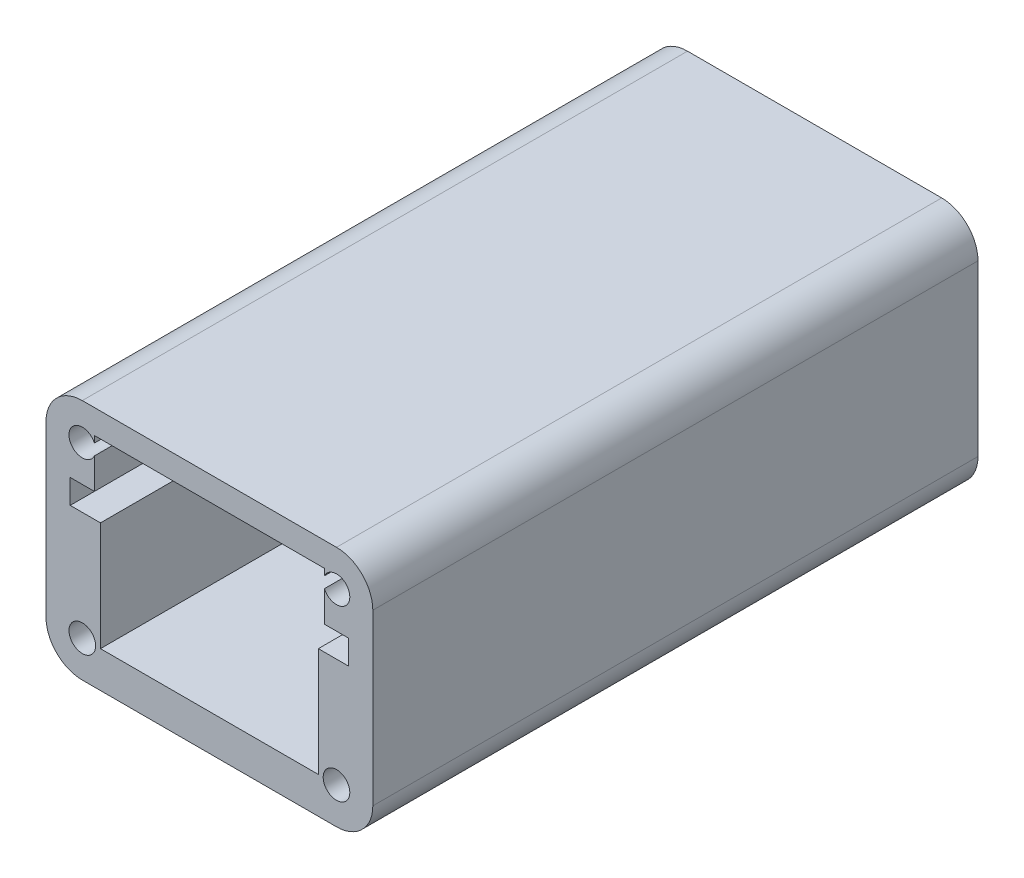
ISO-10303-21;
HEADER;
FILE_DESCRIPTION(('STEP AP214'),'2;1');
FILE_NAME('part.step','',(''),(''),'','','');
FILE_SCHEMA(('AUTOMOTIVE_DESIGN { 1 0 10303 214 1 1 1 1 }'));
ENDSEC;
DATA;
#1=APPLICATION_CONTEXT('core data for automotive mechanical design processes');
#2=APPLICATION_PROTOCOL_DEFINITION('international standard','automotive_design',2000,#1);
#3=PRODUCT_CONTEXT('',#1,'mechanical');
#4=PRODUCT('Part','Part','',(#3));
#5=PRODUCT_RELATED_PRODUCT_CATEGORY('part','',(#4));
#6=PRODUCT_DEFINITION_FORMATION('','',#4);
#7=PRODUCT_DEFINITION_CONTEXT('part definition',#1,'design');
#8=PRODUCT_DEFINITION('design','',#6,#7);
#9=PRODUCT_DEFINITION_SHAPE('','',#8);
#10=(LENGTH_UNIT() NAMED_UNIT(*) SI_UNIT(.MILLI.,.METRE.));
#11=(NAMED_UNIT(*) PLANE_ANGLE_UNIT() SI_UNIT($,.RADIAN.));
#12=(NAMED_UNIT(*) SI_UNIT($,.STERADIAN.) SOLID_ANGLE_UNIT());
#13=UNCERTAINTY_MEASURE_WITH_UNIT(LENGTH_MEASURE(1.E-05),#10,'distance_accuracy_value','');
#14=(GEOMETRIC_REPRESENTATION_CONTEXT(3) GLOBAL_UNCERTAINTY_ASSIGNED_CONTEXT((#13)) GLOBAL_UNIT_ASSIGNED_CONTEXT((#10,
#11,#12)) REPRESENTATION_CONTEXT('',''));
#15=CARTESIAN_POINT('',(0.,0.,0.));
#16=DIRECTION('',(0.,0.,1.));
#17=DIRECTION('',(1.,0.,0.));
#18=AXIS2_PLACEMENT_3D('',#15,#16,#17);
#19=CARTESIAN_POINT('',(23.,16.,-50.));
#20=DIRECTION('',(1.,0.,0.));
#21=DIRECTION('',(0.,0.,-1.));
#22=AXIS2_PLACEMENT_3D('',#19,#20,#21);
#23=PLANE('',#22);
#24=DIRECTION('',(0.,1.,0.));
#25=VECTOR('',#24,1.);
#26=CARTESIAN_POINT('',(23.,16.,0.));
#27=LINE('',#26,#25);
#28=CARTESIAN_POINT('',(23.,14.,0.));
#29=VERTEX_POINT('',#28);
#30=CARTESIAN_POINT('',(23.,16.5417424305044,0.));
#31=VERTEX_POINT('',#30);
#32=EDGE_CURVE('E385',#29,#31,#27,.T.);
#33=ORIENTED_EDGE('',*,*,#32,.T.);
#34=DIRECTION('',(0.,0.,1.));
#35=VECTOR('',#34,1.);
#36=CARTESIAN_POINT('',(23.,16.5417424305044,-6.));
#37=LINE('',#36,#35);
#38=CARTESIAN_POINT('',(23.,16.5417424305044,-6.));
#39=VERTEX_POINT('',#38);
#40=EDGE_CURVE('E61',#39,#31,#37,.T.);
#41=ORIENTED_EDGE('',*,*,#40,.F.);
#42=DIRECTION('',(0.,1.,0.));
#43=VECTOR('',#42,1.);
#44=CARTESIAN_POINT('',(23.,17.,-6.));
#45=LINE('',#44,#43);
#46=CARTESIAN_POINT('',(23.,17.4582575694956,-6.));
#47=VERTEX_POINT('',#46);
#48=EDGE_CURVE('E470',#39,#47,#45,.T.);
#49=ORIENTED_EDGE('',*,*,#48,.T.);
#50=DIRECTION('',(0.,0.,1.));
#51=VECTOR('',#50,1.);
#52=CARTESIAN_POINT('',(23.,17.4582575694956,-6.));
#53=LINE('',#52,#51);
#54=CARTESIAN_POINT('',(23.,17.4582575694956,0.));
#55=VERTEX_POINT('',#54);
#56=EDGE_CURVE('E242',#55,#47,#53,.F.);
#57=ORIENTED_EDGE('',*,*,#56,.F.);
#58=DIRECTION('',(0.,-1.,0.));
#59=VECTOR('',#58,1.);
#60=CARTESIAN_POINT('',(23.,0.,0.));
#61=LINE('',#60,#59);
#62=CARTESIAN_POINT('',(23.,18.,0.));
#63=VERTEX_POINT('',#62);
#64=EDGE_CURVE('E246',#63,#55,#61,.T.);
#65=ORIENTED_EDGE('',*,*,#64,.F.);
#66=DIRECTION('',(0.,0.,1.));
#67=VECTOR('',#66,1.);
#68=CARTESIAN_POINT('',(23.,18.,-67.0591185525459));
#69=LINE('',#68,#67);
#70=CARTESIAN_POINT('',(23.,18.,-48.));
#71=VERTEX_POINT('',#70);
#72=EDGE_CURVE('E235',#71,#63,#69,.T.);
#73=ORIENTED_EDGE('',*,*,#72,.F.);
#74=DIRECTION('',(0.,-1.,0.));
#75=VECTOR('',#74,1.);
#76=CARTESIAN_POINT('',(23.,17.,-48.));
#77=LINE('',#76,#75);
#78=CARTESIAN_POINT('',(23.,14.,-48.));
#79=VERTEX_POINT('',#78);
#80=EDGE_CURVE('E233',#71,#79,#77,.T.);
#81=ORIENTED_EDGE('',*,*,#80,.T.);
#82=DIRECTION('',(0.,0.,1.));
#83=VECTOR('',#82,1.);
#84=CARTESIAN_POINT('',(23.,14.,-50.));
#85=LINE('',#84,#83);
#86=EDGE_CURVE('E371',#79,#29,#85,.T.);
#87=ORIENTED_EDGE('',*,*,#86,.T.);
#88=EDGE_LOOP('',(#33,#41,#49,#57,#65,#73,#81,#87));
#89=FACE_BOUND('',#88,.T.);
#90=ADVANCED_FACE('F45',(#89),#23,.F.);
#91=CARTESIAN_POINT('',(4.,3.,-50.));
#92=DIRECTION('',(0.,-1.,0.));
#93=DIRECTION('',(1.,0.,0.));
#94=AXIS2_PLACEMENT_3D('',#91,#92,#93);
#95=PLANE('',#94);
#96=DIRECTION('',(1.,0.,0.));
#97=VECTOR('',#96,1.);
#98=CARTESIAN_POINT('',(4.,3.,0.));
#99=LINE('',#98,#97);
#100=CARTESIAN_POINT('',(4.5,3.,0.));
#101=VERTEX_POINT('',#100);
#102=CARTESIAN_POINT('',(22.5,3.,0.));
#103=VERTEX_POINT('',#102);
#104=EDGE_CURVE('E382',#101,#103,#99,.T.);
#105=ORIENTED_EDGE('',*,*,#104,.T.);
#106=DIRECTION('',(0.,0.,1.));
#107=VECTOR('',#106,1.);
#108=CARTESIAN_POINT('',(22.5,3.,-67.0065778087482));
#109=LINE('',#108,#107);
#110=CARTESIAN_POINT('',(22.5,3.,-48.));
#111=VERTEX_POINT('',#110);
#112=EDGE_CURVE('E290',#111,#103,#109,.T.);
#113=ORIENTED_EDGE('',*,*,#112,.F.);
#114=DIRECTION('',(-1.,0.,0.));
#115=VECTOR('',#114,1.);
#116=CARTESIAN_POINT('',(23.,3.,-48.));
#117=LINE('',#116,#115);
#118=CARTESIAN_POINT('',(4.5,3.,-48.));
#119=VERTEX_POINT('',#118);
#120=EDGE_CURVE('E221',#111,#119,#117,.T.);
#121=ORIENTED_EDGE('',*,*,#120,.T.);
#122=DIRECTION('',(0.,0.,1.));
#123=VECTOR('',#122,1.);
#124=CARTESIAN_POINT('',(4.5,3.,-67.0065778087482));
#125=LINE('',#124,#123);
#126=EDGE_CURVE('E313',#119,#101,#125,.T.);
#127=ORIENTED_EDGE('',*,*,#126,.T.);
#128=EDGE_LOOP('',(#105,#113,#121,#127));
#129=FACE_BOUND('',#128,.T.);
#130=ADVANCED_FACE('F494',(#129),#95,.F.);
#131=CARTESIAN_POINT('',(4.,4.,-50.));
#132=DIRECTION('',(-1.,0.,0.));
#133=DIRECTION('',(0.,0.,1.));
#134=AXIS2_PLACEMENT_3D('',#131,#132,#133);
#135=PLANE('',#134);
#136=DIRECTION('',(0.,1.,0.));
#137=VECTOR('',#136,1.);
#138=CARTESIAN_POINT('',(4.,17.,-48.));
#139=LINE('',#138,#137);
#140=CARTESIAN_POINT('',(4.,14.,-48.));
#141=VERTEX_POINT('',#140);
#142=CARTESIAN_POINT('',(4.,18.,-48.));
#143=VERTEX_POINT('',#142);
#144=EDGE_CURVE('E210',#141,#143,#139,.T.);
#145=ORIENTED_EDGE('',*,*,#144,.T.);
#146=DIRECTION('',(0.,0.,1.));
#147=VECTOR('',#146,1.);
#148=CARTESIAN_POINT('',(4.,18.,-67.0591185525459));
#149=LINE('',#148,#147);
#150=CARTESIAN_POINT('',(4.,18.,0.));
#151=VERTEX_POINT('',#150);
#152=EDGE_CURVE('E213',#143,#151,#149,.T.);
#153=ORIENTED_EDGE('',*,*,#152,.T.);
#154=DIRECTION('',(0.,1.,0.));
#155=VECTOR('',#154,1.);
#156=CARTESIAN_POINT('',(4.,0.,0.));
#157=LINE('',#156,#155);
#158=CARTESIAN_POINT('',(4.,17.4582575694956,0.));
#159=VERTEX_POINT('',#158);
#160=EDGE_CURVE('E258',#159,#151,#157,.T.);
#161=ORIENTED_EDGE('',*,*,#160,.F.);
#162=DIRECTION('',(0.,0.,1.));
#163=VECTOR('',#162,1.);
#164=CARTESIAN_POINT('',(4.,17.4582575694956,-6.));
#165=LINE('',#164,#163);
#166=CARTESIAN_POINT('',(4.,17.4582575694956,-6.));
#167=VERTEX_POINT('',#166);
#168=EDGE_CURVE('E250',#167,#159,#165,.T.);
#169=ORIENTED_EDGE('',*,*,#168,.F.);
#170=DIRECTION('',(0.,-1.,0.));
#171=VECTOR('',#170,1.);
#172=CARTESIAN_POINT('',(4.,17.,-6.));
#173=LINE('',#172,#171);
#174=CARTESIAN_POINT('',(4.,16.5417424305044,-6.));
#175=VERTEX_POINT('',#174);
#176=EDGE_CURVE('E54',#167,#175,#173,.T.);
#177=ORIENTED_EDGE('',*,*,#176,.T.);
#178=DIRECTION('',(0.,0.,1.));
#179=VECTOR('',#178,1.);
#180=CARTESIAN_POINT('',(4.,16.5417424305044,-6.));
#181=LINE('',#180,#179);
#182=CARTESIAN_POINT('',(4.,16.5417424305044,0.));
#183=VERTEX_POINT('',#182);
#184=EDGE_CURVE('E254',#183,#175,#181,.F.);
#185=ORIENTED_EDGE('',*,*,#184,.F.);
#186=DIRECTION('',(0.,-1.,0.));
#187=VECTOR('',#186,1.);
#188=CARTESIAN_POINT('',(4.,4.,0.));
#189=LINE('',#188,#187);
#190=CARTESIAN_POINT('',(4.,14.,0.));
#191=VERTEX_POINT('',#190);
#192=EDGE_CURVE('E220',#183,#191,#189,.T.);
#193=ORIENTED_EDGE('',*,*,#192,.T.);
#194=DIRECTION('',(0.,0.,-1.));
#195=VECTOR('',#194,1.);
#196=CARTESIAN_POINT('',(4.,14.,-50.));
#197=LINE('',#196,#195);
#198=EDGE_CURVE('E216',#191,#141,#197,.T.);
#199=ORIENTED_EDGE('',*,*,#198,.T.);
#200=EDGE_LOOP('',(#145,#153,#161,#169,#177,#185,#193,#199));
#201=FACE_BOUND('',#200,.T.);
#202=ADVANCED_FACE('F212',(#201),#135,.F.);
#203=CARTESIAN_POINT('',(0.,0.,-50.));
#204=DIRECTION('',(0.,-1.,0.));
#205=DIRECTION('',(0.,0.,-1.));
#206=AXIS2_PLACEMENT_3D('',#203,#204,#205);
#207=PLANE('',#206);
#208=DIRECTION('',(1.,0.,0.));
#209=VECTOR('',#208,1.);
#210=CARTESIAN_POINT('',(0.,0.,-50.));
#211=LINE('',#210,#209);
#212=CARTESIAN_POINT('',(3.,0.,-50.));
#213=VERTEX_POINT('',#212);
#214=CARTESIAN_POINT('',(24.,0.,-50.));
#215=VERTEX_POINT('',#214);
#216=EDGE_CURVE('E389',#213,#215,#211,.T.);
#217=ORIENTED_EDGE('',*,*,#216,.T.);
#218=DIRECTION('',(0.,0.,1.));
#219=VECTOR('',#218,1.);
#220=CARTESIAN_POINT('',(24.,0.,-50.));
#221=LINE('',#220,#219);
#222=CARTESIAN_POINT('',(24.,0.,0.));
#223=VERTEX_POINT('',#222);
#224=EDGE_CURVE('E422',#215,#223,#221,.T.);
#225=ORIENTED_EDGE('',*,*,#224,.T.);
#226=DIRECTION('',(1.,0.,0.));
#227=VECTOR('',#226,1.);
#228=CARTESIAN_POINT('',(0.,0.,0.));
#229=LINE('',#228,#227);
#230=CARTESIAN_POINT('',(3.,0.,0.));
#231=VERTEX_POINT('',#230);
#232=EDGE_CURVE('E388',#231,#223,#229,.T.);
#233=ORIENTED_EDGE('',*,*,#232,.F.);
#234=DIRECTION('',(0.,0.,1.));
#235=VECTOR('',#234,1.);
#236=CARTESIAN_POINT('',(3.,0.,-50.));
#237=LINE('',#236,#235);
#238=EDGE_CURVE('E405',#231,#213,#237,.F.);
#239=ORIENTED_EDGE('',*,*,#238,.T.);
#240=EDGE_LOOP('',(#217,#225,#233,#239));
#241=FACE_BOUND('',#240,.T.);
#242=ADVANCED_FACE('F507',(#241),#207,.T.);
#243=CARTESIAN_POINT('',(0.,20.,-50.));
#244=DIRECTION('',(-1.,0.,0.));
#245=DIRECTION('',(0.,0.,1.));
#246=AXIS2_PLACEMENT_3D('',#243,#244,#245);
#247=PLANE('',#246);
#248=DIRECTION('',(0.,-1.,0.));
#249=VECTOR('',#248,1.);
#250=CARTESIAN_POINT('',(0.,20.,-50.));
#251=LINE('',#250,#249);
#252=CARTESIAN_POINT('',(0.,17.,-50.));
#253=VERTEX_POINT('',#252);
#254=CARTESIAN_POINT('',(0.,3.,-50.));
#255=VERTEX_POINT('',#254);
#256=EDGE_CURVE('E401',#253,#255,#251,.T.);
#257=ORIENTED_EDGE('',*,*,#256,.T.);
#258=DIRECTION('',(0.,0.,1.));
#259=VECTOR('',#258,1.);
#260=CARTESIAN_POINT('',(0.,3.,-50.));
#261=LINE('',#260,#259);
#262=CARTESIAN_POINT('',(0.,3.,0.));
#263=VERTEX_POINT('',#262);
#264=EDGE_CURVE('E466',#255,#263,#261,.T.);
#265=ORIENTED_EDGE('',*,*,#264,.T.);
#266=DIRECTION('',(0.,-1.,0.));
#267=VECTOR('',#266,1.);
#268=CARTESIAN_POINT('',(0.,20.,0.));
#269=LINE('',#268,#267);
#270=CARTESIAN_POINT('',(0.,17.,0.));
#271=VERTEX_POINT('',#270);
#272=EDGE_CURVE('E394',#271,#263,#269,.T.);
#273=ORIENTED_EDGE('',*,*,#272,.F.);
#274=DIRECTION('',(0.,0.,1.));
#275=VECTOR('',#274,1.);
#276=CARTESIAN_POINT('',(0.,17.,-50.));
#277=LINE('',#276,#275);
#278=EDGE_CURVE('E463',#271,#253,#277,.F.);
#279=ORIENTED_EDGE('',*,*,#278,.T.);
#280=EDGE_LOOP('',(#257,#265,#273,#279));
#281=FACE_BOUND('',#280,.T.);
#282=ADVANCED_FACE('F516',(#281),#247,.T.);
#283=CARTESIAN_POINT('',(0.,20.,-50.));
#284=DIRECTION('',(0.,1.,0.));
#285=DIRECTION('',(0.,0.,1.));
#286=AXIS2_PLACEMENT_3D('',#283,#284,#285);
#287=PLANE('',#286);
#288=DIRECTION('',(-1.,0.,0.));
#289=VECTOR('',#288,1.);
#290=CARTESIAN_POINT('',(0.,20.,0.));
#291=LINE('',#290,#289);
#292=CARTESIAN_POINT('',(24.,20.,0.));
#293=VERTEX_POINT('',#292);
#294=CARTESIAN_POINT('',(3.,20.,0.));
#295=VERTEX_POINT('',#294);
#296=EDGE_CURVE('E413',#293,#295,#291,.T.);
#297=ORIENTED_EDGE('',*,*,#296,.F.);
#298=DIRECTION('',(0.,0.,1.));
#299=VECTOR('',#298,1.);
#300=CARTESIAN_POINT('',(24.,20.,-50.));
#301=LINE('',#300,#299);
#302=CARTESIAN_POINT('',(24.,20.,-50.));
#303=VERTEX_POINT('',#302);
#304=EDGE_CURVE('E460',#293,#303,#301,.F.);
#305=ORIENTED_EDGE('',*,*,#304,.T.);
#306=DIRECTION('',(-1.,0.,0.));
#307=VECTOR('',#306,1.);
#308=CARTESIAN_POINT('',(0.,20.,-50.));
#309=LINE('',#308,#307);
#310=CARTESIAN_POINT('',(3.,20.,-50.));
#311=VERTEX_POINT('',#310);
#312=EDGE_CURVE('E398',#303,#311,#309,.T.);
#313=ORIENTED_EDGE('',*,*,#312,.T.);
#314=DIRECTION('',(0.,0.,1.));
#315=VECTOR('',#314,1.);
#316=CARTESIAN_POINT('',(3.,20.,-50.));
#317=LINE('',#316,#315);
#318=EDGE_CURVE('E456',#311,#295,#317,.T.);
#319=ORIENTED_EDGE('',*,*,#318,.T.);
#320=EDGE_LOOP('',(#297,#305,#313,#319));
#321=FACE_BOUND('',#320,.T.);
#322=ADVANCED_FACE('F519',(#321),#287,.T.);
#323=CARTESIAN_POINT('',(27.,20.,-50.));
#324=DIRECTION('',(1.,0.,0.));
#325=DIRECTION('',(0.,1.,0.));
#326=AXIS2_PLACEMENT_3D('',#323,#324,#325);
#327=PLANE('',#326);
#328=DIRECTION('',(0.,1.,0.));
#329=VECTOR('',#328,1.);
#330=CARTESIAN_POINT('',(27.,20.,0.));
#331=LINE('',#330,#329);
#332=CARTESIAN_POINT('',(27.,3.,0.));
#333=VERTEX_POINT('',#332);
#334=CARTESIAN_POINT('',(27.,17.,0.));
#335=VERTEX_POINT('',#334);
#336=EDGE_CURVE('E409',#333,#335,#331,.T.);
#337=ORIENTED_EDGE('',*,*,#336,.F.);
#338=DIRECTION('',(0.,0.,1.));
#339=VECTOR('',#338,1.);
#340=CARTESIAN_POINT('',(27.,3.,-50.));
#341=LINE('',#340,#339);
#342=CARTESIAN_POINT('',(27.,3.,-50.));
#343=VERTEX_POINT('',#342);
#344=EDGE_CURVE('E442',#333,#343,#341,.F.);
#345=ORIENTED_EDGE('',*,*,#344,.T.);
#346=DIRECTION('',(0.,1.,0.));
#347=VECTOR('',#346,1.);
#348=CARTESIAN_POINT('',(27.,20.,-50.));
#349=LINE('',#348,#347);
#350=CARTESIAN_POINT('',(27.,17.,-50.));
#351=VERTEX_POINT('',#350);
#352=EDGE_CURVE('E393',#343,#351,#349,.T.);
#353=ORIENTED_EDGE('',*,*,#352,.T.);
#354=DIRECTION('',(0.,0.,1.));
#355=VECTOR('',#354,1.);
#356=CARTESIAN_POINT('',(27.,17.,-50.));
#357=LINE('',#356,#355);
#358=EDGE_CURVE('E438',#351,#335,#357,.T.);
#359=ORIENTED_EDGE('',*,*,#358,.T.);
#360=EDGE_LOOP('',(#337,#345,#353,#359));
#361=FACE_BOUND('',#360,.T.);
#362=ADVANCED_FACE('F512',(#361),#327,.T.);
#363=CARTESIAN_POINT('',(0.,0.,-50.));
#364=DIRECTION('',(0.,0.,-1.));
#365=DIRECTION('',(-1.,0.,0.));
#366=AXIS2_PLACEMENT_3D('',#363,#364,#365);
#367=PLANE('',#366);
#368=ORIENTED_EDGE('',*,*,#352,.F.);
#369=CARTESIAN_POINT('',(24.,3.,-50.));
#370=DIRECTION('',(0.,0.,-1.));
#371=DIRECTION('',(-1.,0.,0.));
#372=AXIS2_PLACEMENT_3D('',#369,#370,#371);
#373=CIRCLE('',#372,3.);
#374=EDGE_CURVE('E453',#343,#215,#373,.T.);
#375=ORIENTED_EDGE('',*,*,#374,.T.);
#376=ORIENTED_EDGE('',*,*,#216,.F.);
#377=CARTESIAN_POINT('',(3.,3.,-50.));
#378=DIRECTION('',(0.,0.,-1.));
#379=DIRECTION('',(-1.,0.,0.));
#380=AXIS2_PLACEMENT_3D('',#377,#378,#379);
#381=CIRCLE('',#380,3.);
#382=EDGE_CURVE('E447',#213,#255,#381,.T.);
#383=ORIENTED_EDGE('',*,*,#382,.T.);
#384=ORIENTED_EDGE('',*,*,#256,.F.);
#385=CARTESIAN_POINT('',(3.,17.,-50.));
#386=DIRECTION('',(0.,0.,-1.));
#387=DIRECTION('',(-1.,0.,0.));
#388=AXIS2_PLACEMENT_3D('',#385,#386,#387);
#389=CIRCLE('',#388,3.);
#390=EDGE_CURVE('E69',#253,#311,#389,.T.);
#391=ORIENTED_EDGE('',*,*,#390,.T.);
#392=ORIENTED_EDGE('',*,*,#312,.F.);
#393=CARTESIAN_POINT('',(24.,17.,-50.));
#394=DIRECTION('',(0.,0.,-1.));
#395=DIRECTION('',(-1.,0.,0.));
#396=AXIS2_PLACEMENT_3D('',#393,#394,#395);
#397=CIRCLE('',#396,3.);
#398=EDGE_CURVE('E450',#303,#351,#397,.T.);
#399=ORIENTED_EDGE('',*,*,#398,.T.);
#400=EDGE_LOOP('',(#368,#375,#376,#383,#384,#391,#392,#399));
#401=FACE_BOUND('',#400,.T.);
#402=ADVANCED_FACE('F508',(#401),#367,.T.);
#403=CARTESIAN_POINT('',(0.,0.,0.));
#404=DIRECTION('',(0.,0.,-1.));
#405=DIRECTION('',(-1.,0.,0.));
#406=AXIS2_PLACEMENT_3D('',#403,#404,#405);
#407=PLANE('',#406);
#408=CARTESIAN_POINT('',(3.,3.,0.));
#409=DIRECTION('',(0.,0.,1.));
#410=DIRECTION('',(1.,0.,0.));
#411=AXIS2_PLACEMENT_3D('',#408,#409,#410);
#412=CIRCLE('',#411,1.1);
#413=CARTESIAN_POINT('',(4.1,3.,0.));
#414=VERTEX_POINT('',#413);
#415=EDGE_CURVE('E279',#414,#414,#412,.T.);
#416=ORIENTED_EDGE('',*,*,#415,.F.);
#417=EDGE_LOOP('',(#416));
#418=FACE_BOUND('',#417,.T.);
#419=CARTESIAN_POINT('',(24.,3.,0.));
#420=DIRECTION('',(0.,0.,1.));
#421=DIRECTION('',(1.,0.,0.));
#422=AXIS2_PLACEMENT_3D('',#419,#420,#421);
#423=CIRCLE('',#422,1.1);
#424=CARTESIAN_POINT('',(25.1,3.,0.));
#425=VERTEX_POINT('',#424);
#426=EDGE_CURVE('E271',#425,#425,#423,.T.);
#427=ORIENTED_EDGE('',*,*,#426,.F.);
#428=EDGE_LOOP('',(#427));
#429=FACE_BOUND('',#428,.T.);
#430=CARTESIAN_POINT('',(24.,17.,0.));
#431=DIRECTION('',(0.,0.,1.));
#432=DIRECTION('',(1.,0.,0.));
#433=AXIS2_PLACEMENT_3D('',#430,#431,#432);
#434=CIRCLE('',#433,1.1);
#435=EDGE_CURVE('E262',#31,#55,#434,.T.);
#436=ORIENTED_EDGE('',*,*,#435,.F.);
#437=ORIENTED_EDGE('',*,*,#32,.F.);
#438=DIRECTION('',(-1.,0.,0.));
#439=VECTOR('',#438,1.);
#440=CARTESIAN_POINT('',(1.99999999999999,14.,0.));
#441=LINE('',#440,#439);
#442=CARTESIAN_POINT('',(25.,14.,0.));
#443=VERTEX_POINT('',#442);
#444=EDGE_CURVE('E325',#443,#29,#441,.T.);
#445=ORIENTED_EDGE('',*,*,#444,.F.);
#446=DIRECTION('',(0.,1.,0.));
#447=VECTOR('',#446,1.);
#448=CARTESIAN_POINT('',(25.,14.,0.));
#449=LINE('',#448,#447);
#450=CARTESIAN_POINT('',(25.,12.,0.));
#451=VERTEX_POINT('',#450);
#452=EDGE_CURVE('E330',#451,#443,#449,.T.);
#453=ORIENTED_EDGE('',*,*,#452,.F.);
#454=DIRECTION('',(1.,0.,0.));
#455=VECTOR('',#454,1.);
#456=CARTESIAN_POINT('',(1.99999999999999,12.,0.));
#457=LINE('',#456,#455);
#458=CARTESIAN_POINT('',(22.5,12.,0.));
#459=VERTEX_POINT('',#458);
#460=EDGE_CURVE('E336',#459,#451,#457,.T.);
#461=ORIENTED_EDGE('',*,*,#460,.F.);
#462=DIRECTION('',(0.,-1.,0.));
#463=VECTOR('',#462,1.);
#464=CARTESIAN_POINT('',(22.5,12.,0.));
#465=LINE('',#464,#463);
#466=EDGE_CURVE('E298',#459,#103,#465,.T.);
#467=ORIENTED_EDGE('',*,*,#466,.T.);
#468=ORIENTED_EDGE('',*,*,#104,.F.);
#469=DIRECTION('',(0.,1.,0.));
#470=VECTOR('',#469,1.);
#471=CARTESIAN_POINT('',(4.5,12.,0.));
#472=LINE('',#471,#470);
#473=CARTESIAN_POINT('',(4.5,12.,0.));
#474=VERTEX_POINT('',#473);
#475=EDGE_CURVE('E309',#101,#474,#472,.T.);
#476=ORIENTED_EDGE('',*,*,#475,.T.);
#477=CARTESIAN_POINT('',(1.99999999999999,12.,0.));
#478=VERTEX_POINT('',#477);
#479=EDGE_CURVE('E333',#478,#474,#457,.T.);
#480=ORIENTED_EDGE('',*,*,#479,.F.);
#481=DIRECTION('',(0.,-1.,0.));
#482=VECTOR('',#481,1.);
#483=CARTESIAN_POINT('',(1.99999999999999,14.,0.));
#484=LINE('',#483,#482);
#485=CARTESIAN_POINT('',(1.99999999999999,14.,0.));
#486=VERTEX_POINT('',#485);
#487=EDGE_CURVE('E322',#486,#478,#484,.T.);
#488=ORIENTED_EDGE('',*,*,#487,.F.);
#489=EDGE_CURVE('E329',#191,#486,#441,.T.);
#490=ORIENTED_EDGE('',*,*,#489,.F.);
#491=ORIENTED_EDGE('',*,*,#192,.F.);
#492=CARTESIAN_POINT('',(3.,17.,0.));
#493=DIRECTION('',(0.,0.,1.));
#494=DIRECTION('',(1.,0.,0.));
#495=AXIS2_PLACEMENT_3D('',#492,#493,#494);
#496=CIRCLE('',#495,1.1);
#497=EDGE_CURVE('E266',#159,#183,#496,.T.);
#498=ORIENTED_EDGE('',*,*,#497,.F.);
#499=ORIENTED_EDGE('',*,*,#160,.T.);
#500=DIRECTION('',(1.,0.,0.));
#501=VECTOR('',#500,1.);
#502=CARTESIAN_POINT('',(0.,18.,0.));
#503=LINE('',#502,#501);
#504=EDGE_CURVE('E11',#151,#63,#503,.T.);
#505=ORIENTED_EDGE('',*,*,#504,.T.);
#506=ORIENTED_EDGE('',*,*,#64,.T.);
#507=EDGE_LOOP('',(#436,#437,#445,#453,#461,#467,#468,#476,#480,#488,#490,#491,#498,#499,#505,#506));
#508=FACE_BOUND('',#507,.T.);
#509=ORIENTED_EDGE('',*,*,#232,.T.);
#510=CARTESIAN_POINT('',(24.,3.,0.));
#511=DIRECTION('',(0.,0.,-1.));
#512=DIRECTION('',(-1.,0.,0.));
#513=AXIS2_PLACEMENT_3D('',#510,#511,#512);
#514=CIRCLE('',#513,3.);
#515=EDGE_CURVE('E435',#223,#333,#514,.F.);
#516=ORIENTED_EDGE('',*,*,#515,.T.);
#517=ORIENTED_EDGE('',*,*,#336,.T.);
#518=CARTESIAN_POINT('',(24.,17.,0.));
#519=DIRECTION('',(0.,0.,-1.));
#520=DIRECTION('',(-1.,0.,0.));
#521=AXIS2_PLACEMENT_3D('',#518,#519,#520);
#522=CIRCLE('',#521,3.);
#523=EDGE_CURVE('E432',#335,#293,#522,.F.);
#524=ORIENTED_EDGE('',*,*,#523,.T.);
#525=ORIENTED_EDGE('',*,*,#296,.T.);
#526=CARTESIAN_POINT('',(3.,17.,0.));
#527=DIRECTION('',(0.,0.,-1.));
#528=DIRECTION('',(-1.,0.,0.));
#529=AXIS2_PLACEMENT_3D('',#526,#527,#528);
#530=CIRCLE('',#529,3.);
#531=EDGE_CURVE('E426',#295,#271,#530,.F.);
#532=ORIENTED_EDGE('',*,*,#531,.T.);
#533=ORIENTED_EDGE('',*,*,#272,.T.);
#534=CARTESIAN_POINT('',(3.,3.,0.));
#535=DIRECTION('',(0.,0.,-1.));
#536=DIRECTION('',(-1.,0.,0.));
#537=AXIS2_PLACEMENT_3D('',#534,#535,#536);
#538=CIRCLE('',#537,3.);
#539=EDGE_CURVE('E429',#263,#231,#538,.F.);
#540=ORIENTED_EDGE('',*,*,#539,.T.);
#541=EDGE_LOOP('',(#509,#516,#517,#524,#525,#532,#533,#540));
#542=FACE_BOUND('',#541,.T.);
#543=ADVANCED_FACE('F511',(#418,#429,#508,#542),#407,.F.);
#544=CARTESIAN_POINT('',(0.,0.,-48.));
#545=DIRECTION('',(0.,0.,-1.));
#546=DIRECTION('',(-1.,0.,0.));
#547=AXIS2_PLACEMENT_3D('',#544,#545,#546);
#548=PLANE('',#547);
#549=ORIENTED_EDGE('',*,*,#80,.F.);
#550=DIRECTION('',(-1.,0.,0.));
#551=VECTOR('',#550,1.);
#552=CARTESIAN_POINT('',(4.,18.,-48.));
#553=LINE('',#552,#551);
#554=EDGE_CURVE('E227',#71,#143,#553,.T.);
#555=ORIENTED_EDGE('',*,*,#554,.T.);
#556=ORIENTED_EDGE('',*,*,#144,.F.);
#557=DIRECTION('',(-1.,0.,0.));
#558=VECTOR('',#557,1.);
#559=CARTESIAN_POINT('',(1.99999999999999,14.,-48.));
#560=LINE('',#559,#558);
#561=CARTESIAN_POINT('',(1.99999999999999,14.,-48.));
#562=VERTEX_POINT('',#561);
#563=EDGE_CURVE('E353',#141,#562,#560,.T.);
#564=ORIENTED_EDGE('',*,*,#563,.T.);
#565=DIRECTION('',(0.,-1.,0.));
#566=VECTOR('',#565,1.);
#567=CARTESIAN_POINT('',(1.99999999999999,14.,-48.));
#568=LINE('',#567,#566);
#569=CARTESIAN_POINT('',(1.99999999999999,12.,-48.));
#570=VERTEX_POINT('',#569);
#571=EDGE_CURVE('E344',#562,#570,#568,.T.);
#572=ORIENTED_EDGE('',*,*,#571,.T.);
#573=DIRECTION('',(1.,0.,0.));
#574=VECTOR('',#573,1.);
#575=CARTESIAN_POINT('',(1.99999999999999,12.,-48.));
#576=LINE('',#575,#574);
#577=CARTESIAN_POINT('',(4.5,12.,-48.));
#578=VERTEX_POINT('',#577);
#579=EDGE_CURVE('E340',#570,#578,#576,.T.);
#580=ORIENTED_EDGE('',*,*,#579,.T.);
#581=DIRECTION('',(0.,1.,0.));
#582=VECTOR('',#581,1.);
#583=CARTESIAN_POINT('',(4.5,12.,-48.));
#584=LINE('',#583,#582);
#585=EDGE_CURVE('E314',#119,#578,#584,.T.);
#586=ORIENTED_EDGE('',*,*,#585,.F.);
#587=ORIENTED_EDGE('',*,*,#120,.F.);
#588=DIRECTION('',(0.,-1.,0.));
#589=VECTOR('',#588,1.);
#590=CARTESIAN_POINT('',(22.5,12.,-48.));
#591=LINE('',#590,#589);
#592=CARTESIAN_POINT('',(22.5,12.,-48.));
#593=VERTEX_POINT('',#592);
#594=EDGE_CURVE('E299',#593,#111,#591,.T.);
#595=ORIENTED_EDGE('',*,*,#594,.F.);
#596=CARTESIAN_POINT('',(25.,12.,-48.));
#597=VERTEX_POINT('',#596);
#598=EDGE_CURVE('E328',#593,#597,#576,.T.);
#599=ORIENTED_EDGE('',*,*,#598,.T.);
#600=DIRECTION('',(0.,1.,0.));
#601=VECTOR('',#600,1.);
#602=CARTESIAN_POINT('',(25.,14.,-48.));
#603=LINE('',#602,#601);
#604=CARTESIAN_POINT('',(25.,14.,-48.));
#605=VERTEX_POINT('',#604);
#606=EDGE_CURVE('E354',#597,#605,#603,.T.);
#607=ORIENTED_EDGE('',*,*,#606,.T.);
#608=EDGE_CURVE('E350',#605,#79,#560,.T.);
#609=ORIENTED_EDGE('',*,*,#608,.T.);
#610=EDGE_LOOP('',(#549,#555,#556,#564,#572,#580,#586,#587,#595,#599,#607,#609));
#611=FACE_BOUND('',#610,.T.);
#612=ADVANCED_FACE('F231',(#611),#548,.F.);
#613=CARTESIAN_POINT('',(1.99999999999999,14.,-71.0867927612304));
#614=DIRECTION('',(-1.,0.,0.));
#615=DIRECTION('',(0.,-1.,0.));
#616=AXIS2_PLACEMENT_3D('',#613,#614,#615);
#617=PLANE('',#616);
#618=DIRECTION('',(0.,0.,1.));
#619=VECTOR('',#618,1.);
#620=CARTESIAN_POINT('',(1.99999999999999,14.,-71.0867927612304));
#621=LINE('',#620,#619);
#622=EDGE_CURVE('E349',#562,#486,#621,.T.);
#623=ORIENTED_EDGE('',*,*,#622,.T.);
#624=ORIENTED_EDGE('',*,*,#487,.T.);
#625=DIRECTION('',(0.,0.,1.));
#626=VECTOR('',#625,1.);
#627=CARTESIAN_POINT('',(1.99999999999999,12.,-71.0867927612304));
#628=LINE('',#627,#626);
#629=EDGE_CURVE('E348',#570,#478,#628,.T.);
#630=ORIENTED_EDGE('',*,*,#629,.F.);
#631=ORIENTED_EDGE('',*,*,#571,.F.);
#632=EDGE_LOOP('',(#623,#624,#630,#631));
#633=FACE_BOUND('',#632,.T.);
#634=ADVANCED_FACE('F627',(#633),#617,.F.);
#635=CARTESIAN_POINT('',(1.99999999999999,14.,-71.0867927612304));
#636=DIRECTION('',(0.,1.,0.));
#637=DIRECTION('',(-1.,0.,0.));
#638=AXIS2_PLACEMENT_3D('',#635,#636,#637);
#639=PLANE('',#638);
#640=ORIENTED_EDGE('',*,*,#489,.T.);
#641=ORIENTED_EDGE('',*,*,#622,.F.);
#642=ORIENTED_EDGE('',*,*,#563,.F.);
#643=ORIENTED_EDGE('',*,*,#198,.F.);
#644=EDGE_LOOP('',(#640,#641,#642,#643));
#645=FACE_BOUND('',#644,.T.);
#646=ADVANCED_FACE('F713',(#645),#639,.F.);
#647=CARTESIAN_POINT('',(1.99999999999999,12.,-71.0867927612304));
#648=DIRECTION('',(0.,-1.,0.));
#649=DIRECTION('',(1.,0.,0.));
#650=AXIS2_PLACEMENT_3D('',#647,#648,#649);
#651=PLANE('',#650);
#652=ORIENTED_EDGE('',*,*,#579,.F.);
#653=ORIENTED_EDGE('',*,*,#629,.T.);
#654=ORIENTED_EDGE('',*,*,#479,.T.);
#655=DIRECTION('',(0.,0.,1.));
#656=VECTOR('',#655,1.);
#657=CARTESIAN_POINT('',(4.5,12.,-67.0065778087482));
#658=LINE('',#657,#656);
#659=EDGE_CURVE('E318',#578,#474,#658,.T.);
#660=ORIENTED_EDGE('',*,*,#659,.F.);
#661=EDGE_LOOP('',(#652,#653,#654,#660));
#662=FACE_BOUND('',#661,.T.);
#663=ADVANCED_FACE('F720',(#662),#651,.F.);
#664=ORIENTED_EDGE('',*,*,#460,.T.);
#665=DIRECTION('',(0.,0.,1.));
#666=VECTOR('',#665,1.);
#667=CARTESIAN_POINT('',(25.,12.,-71.0867927612304));
#668=LINE('',#667,#666);
#669=EDGE_CURVE('E343',#597,#451,#668,.T.);
#670=ORIENTED_EDGE('',*,*,#669,.F.);
#671=ORIENTED_EDGE('',*,*,#598,.F.);
#672=DIRECTION('',(0.,0.,1.));
#673=VECTOR('',#672,1.);
#674=CARTESIAN_POINT('',(22.5,12.,-67.0065778087482));
#675=LINE('',#674,#673);
#676=EDGE_CURVE('E294',#593,#459,#675,.T.);
#677=ORIENTED_EDGE('',*,*,#676,.T.);
#678=EDGE_LOOP('',(#664,#670,#671,#677));
#679=FACE_BOUND('',#678,.T.);
#680=ADVANCED_FACE('F710',(#679),#651,.F.);
#681=ORIENTED_EDGE('',*,*,#608,.F.);
#682=DIRECTION('',(0.,0.,1.));
#683=VECTOR('',#682,1.);
#684=CARTESIAN_POINT('',(25.,14.,-71.0867927612304));
#685=LINE('',#684,#683);
#686=EDGE_CURVE('E358',#605,#443,#685,.T.);
#687=ORIENTED_EDGE('',*,*,#686,.T.);
#688=ORIENTED_EDGE('',*,*,#444,.T.);
#689=ORIENTED_EDGE('',*,*,#86,.F.);
#690=EDGE_LOOP('',(#681,#687,#688,#689));
#691=FACE_BOUND('',#690,.T.);
#692=ADVANCED_FACE('F700',(#691),#639,.F.);
#693=CARTESIAN_POINT('',(25.,14.,-71.0867927612304));
#694=DIRECTION('',(1.,0.,0.));
#695=DIRECTION('',(0.,0.,-1.));
#696=AXIS2_PLACEMENT_3D('',#693,#694,#695);
#697=PLANE('',#696);
#698=ORIENTED_EDGE('',*,*,#669,.T.);
#699=ORIENTED_EDGE('',*,*,#452,.T.);
#700=ORIENTED_EDGE('',*,*,#686,.F.);
#701=ORIENTED_EDGE('',*,*,#606,.F.);
#702=EDGE_LOOP('',(#698,#699,#700,#701));
#703=FACE_BOUND('',#702,.T.);
#704=ADVANCED_FACE('F690',(#703),#697,.F.);
#705=CARTESIAN_POINT('',(22.5,12.,-67.0065778087482));
#706=DIRECTION('',(-1.,0.,0.));
#707=DIRECTION('',(0.,0.,1.));
#708=AXIS2_PLACEMENT_3D('',#705,#706,#707);
#709=PLANE('',#708);
#710=ORIENTED_EDGE('',*,*,#676,.F.);
#711=ORIENTED_EDGE('',*,*,#594,.T.);
#712=ORIENTED_EDGE('',*,*,#112,.T.);
#713=ORIENTED_EDGE('',*,*,#466,.F.);
#714=EDGE_LOOP('',(#710,#711,#712,#713));
#715=FACE_BOUND('',#714,.T.);
#716=ADVANCED_FACE('F681',(#715),#709,.T.);
#717=CARTESIAN_POINT('',(4.5,12.,-67.0065778087482));
#718=DIRECTION('',(1.,0.,0.));
#719=DIRECTION('',(0.,1.,0.));
#720=AXIS2_PLACEMENT_3D('',#717,#718,#719);
#721=PLANE('',#720);
#722=ORIENTED_EDGE('',*,*,#126,.F.);
#723=ORIENTED_EDGE('',*,*,#585,.T.);
#724=ORIENTED_EDGE('',*,*,#659,.T.);
#725=ORIENTED_EDGE('',*,*,#475,.F.);
#726=EDGE_LOOP('',(#722,#723,#724,#725));
#727=FACE_BOUND('',#726,.T.);
#728=ADVANCED_FACE('F534',(#727),#721,.T.);
#729=CARTESIAN_POINT('',(24.,3.,-50.));
#730=DIRECTION('',(0.,0.,1.));
#731=DIRECTION('',(1.,0.,0.));
#732=AXIS2_PLACEMENT_3D('',#729,#730,#731);
#733=CYLINDRICAL_SURFACE('',#732,3.);
#734=ORIENTED_EDGE('',*,*,#374,.F.);
#735=ORIENTED_EDGE('',*,*,#344,.F.);
#736=ORIENTED_EDGE('',*,*,#515,.F.);
#737=ORIENTED_EDGE('',*,*,#224,.F.);
#738=EDGE_LOOP('',(#734,#735,#736,#737));
#739=FACE_BOUND('',#738,.T.);
#740=ADVANCED_FACE('F530',(#739),#733,.T.);
#741=CARTESIAN_POINT('',(24.,17.,-50.));
#742=DIRECTION('',(0.,0.,1.));
#743=DIRECTION('',(1.,0.,0.));
#744=AXIS2_PLACEMENT_3D('',#741,#742,#743);
#745=CYLINDRICAL_SURFACE('',#744,3.);
#746=ORIENTED_EDGE('',*,*,#398,.F.);
#747=ORIENTED_EDGE('',*,*,#304,.F.);
#748=ORIENTED_EDGE('',*,*,#523,.F.);
#749=ORIENTED_EDGE('',*,*,#358,.F.);
#750=EDGE_LOOP('',(#746,#747,#748,#749));
#751=FACE_BOUND('',#750,.T.);
#752=ADVANCED_FACE('F533',(#751),#745,.T.);
#753=CARTESIAN_POINT('',(3.,3.,-50.));
#754=DIRECTION('',(0.,0.,1.));
#755=DIRECTION('',(1.,0.,0.));
#756=AXIS2_PLACEMENT_3D('',#753,#754,#755);
#757=CYLINDRICAL_SURFACE('',#756,3.);
#758=ORIENTED_EDGE('',*,*,#382,.F.);
#759=ORIENTED_EDGE('',*,*,#238,.F.);
#760=ORIENTED_EDGE('',*,*,#539,.F.);
#761=ORIENTED_EDGE('',*,*,#264,.F.);
#762=EDGE_LOOP('',(#758,#759,#760,#761));
#763=FACE_BOUND('',#762,.T.);
#764=ADVANCED_FACE('F537',(#763),#757,.T.);
#765=CARTESIAN_POINT('',(3.,17.,-50.));
#766=DIRECTION('',(0.,0.,1.));
#767=DIRECTION('',(1.,0.,0.));
#768=AXIS2_PLACEMENT_3D('',#765,#766,#767);
#769=CYLINDRICAL_SURFACE('',#768,3.);
#770=ORIENTED_EDGE('',*,*,#390,.F.);
#771=ORIENTED_EDGE('',*,*,#278,.F.);
#772=ORIENTED_EDGE('',*,*,#531,.F.);
#773=ORIENTED_EDGE('',*,*,#318,.F.);
#774=EDGE_LOOP('',(#770,#771,#772,#773));
#775=FACE_BOUND('',#774,.T.);
#776=ADVANCED_FACE('F47',(#775),#769,.T.);
#777=CARTESIAN_POINT('',(3.,17.,-6.));
#778=DIRECTION('',(0.,0.,1.));
#779=DIRECTION('',(1.,0.,0.));
#780=AXIS2_PLACEMENT_3D('',#777,#778,#779);
#781=CYLINDRICAL_SURFACE('',#780,1.1);
#782=ORIENTED_EDGE('',*,*,#497,.T.);
#783=ORIENTED_EDGE('',*,*,#184,.T.);
#784=CARTESIAN_POINT('',(3.,17.,-6.));
#785=DIRECTION('',(0.,0.,1.));
#786=DIRECTION('',(1.,0.,0.));
#787=AXIS2_PLACEMENT_3D('',#784,#785,#786);
#788=CIRCLE('',#787,1.1);
#789=EDGE_CURVE('E286',#167,#175,#788,.T.);
#790=ORIENTED_EDGE('',*,*,#789,.F.);
#791=ORIENTED_EDGE('',*,*,#168,.T.);
#792=EDGE_LOOP('',(#782,#783,#790,#791));
#793=FACE_BOUND('',#792,.T.);
#794=ADVANCED_FACE('F478',(#793),#781,.F.);
#795=CARTESIAN_POINT('',(3.,17.,-6.));
#796=DIRECTION('',(0.,0.,1.));
#797=DIRECTION('',(1.,0.,0.));
#798=AXIS2_PLACEMENT_3D('',#795,#796,#797);
#799=PLANE('',#798);
#800=ORIENTED_EDGE('',*,*,#176,.F.);
#801=ORIENTED_EDGE('',*,*,#789,.T.);
#802=EDGE_LOOP('',(#800,#801));
#803=FACE_BOUND('',#802,.T.);
#804=ADVANCED_FACE('F480',(#803),#799,.T.);
#805=CARTESIAN_POINT('',(24.,17.,-6.));
#806=DIRECTION('',(0.,0.,1.));
#807=DIRECTION('',(1.,0.,0.));
#808=AXIS2_PLACEMENT_3D('',#805,#806,#807);
#809=CYLINDRICAL_SURFACE('',#808,1.1);
#810=ORIENTED_EDGE('',*,*,#435,.T.);
#811=ORIENTED_EDGE('',*,*,#56,.T.);
#812=CARTESIAN_POINT('',(24.,17.,-6.));
#813=DIRECTION('',(0.,0.,1.));
#814=DIRECTION('',(1.,0.,0.));
#815=AXIS2_PLACEMENT_3D('',#812,#813,#814);
#816=CIRCLE('',#815,1.1);
#817=EDGE_CURVE('E267',#39,#47,#816,.T.);
#818=ORIENTED_EDGE('',*,*,#817,.F.);
#819=ORIENTED_EDGE('',*,*,#40,.T.);
#820=EDGE_LOOP('',(#810,#811,#818,#819));
#821=FACE_BOUND('',#820,.T.);
#822=ADVANCED_FACE('F482',(#821),#809,.F.);
#823=CARTESIAN_POINT('',(24.,17.,-6.));
#824=DIRECTION('',(0.,0.,1.));
#825=DIRECTION('',(1.,0.,0.));
#826=AXIS2_PLACEMENT_3D('',#823,#824,#825);
#827=PLANE('',#826);
#828=ORIENTED_EDGE('',*,*,#48,.F.);
#829=ORIENTED_EDGE('',*,*,#817,.T.);
#830=EDGE_LOOP('',(#828,#829));
#831=FACE_BOUND('',#830,.T.);
#832=ADVANCED_FACE('F488',(#831),#827,.T.);
#833=CARTESIAN_POINT('',(24.,3.,-6.));
#834=DIRECTION('',(0.,0.,1.));
#835=DIRECTION('',(1.,0.,0.));
#836=AXIS2_PLACEMENT_3D('',#833,#834,#835);
#837=CYLINDRICAL_SURFACE('',#836,1.1);
#838=CARTESIAN_POINT('',(24.,3.,-6.));
#839=DIRECTION('',(0.,0.,1.));
#840=DIRECTION('',(1.,0.,0.));
#841=AXIS2_PLACEMENT_3D('',#838,#839,#840);
#842=CIRCLE('',#841,1.1);
#843=CARTESIAN_POINT('',(25.1,3.,-6.));
#844=VERTEX_POINT('',#843);
#845=EDGE_CURVE('E275',#844,#844,#842,.T.);
#846=ORIENTED_EDGE('',*,*,#845,.F.);
#847=EDGE_LOOP('',(#846));
#848=FACE_BOUND('',#847,.T.);
#849=ORIENTED_EDGE('',*,*,#426,.T.);
#850=EDGE_LOOP('',(#849));
#851=FACE_BOUND('',#850,.T.);
#852=ADVANCED_FACE('F570',(#848,#851),#837,.F.);
#853=CARTESIAN_POINT('',(24.,3.,-6.));
#854=DIRECTION('',(0.,0.,1.));
#855=DIRECTION('',(1.,0.,0.));
#856=AXIS2_PLACEMENT_3D('',#853,#854,#855);
#857=PLANE('',#856);
#858=ORIENTED_EDGE('',*,*,#845,.T.);
#859=EDGE_LOOP('',(#858));
#860=FACE_BOUND('',#859,.T.);
#861=ADVANCED_FACE('F574',(#860),#857,.T.);
#862=CARTESIAN_POINT('',(3.,3.,-6.));
#863=DIRECTION('',(0.,0.,1.));
#864=DIRECTION('',(1.,0.,0.));
#865=AXIS2_PLACEMENT_3D('',#862,#863,#864);
#866=CYLINDRICAL_SURFACE('',#865,1.1);
#867=CARTESIAN_POINT('',(3.,3.,-6.));
#868=DIRECTION('',(0.,0.,1.));
#869=DIRECTION('',(1.,0.,0.));
#870=AXIS2_PLACEMENT_3D('',#867,#868,#869);
#871=CIRCLE('',#870,1.1);
#872=CARTESIAN_POINT('',(4.1,3.,-6.));
#873=VERTEX_POINT('',#872);
#874=EDGE_CURVE('E261',#873,#873,#871,.T.);
#875=ORIENTED_EDGE('',*,*,#874,.F.);
#876=EDGE_LOOP('',(#875));
#877=FACE_BOUND('',#876,.T.);
#878=ORIENTED_EDGE('',*,*,#415,.T.);
#879=EDGE_LOOP('',(#878));
#880=FACE_BOUND('',#879,.T.);
#881=ADVANCED_FACE('F584',(#877,#880),#866,.F.);
#882=CARTESIAN_POINT('',(3.,3.,-6.));
#883=DIRECTION('',(0.,0.,1.));
#884=DIRECTION('',(1.,0.,0.));
#885=AXIS2_PLACEMENT_3D('',#882,#883,#884);
#886=PLANE('',#885);
#887=ORIENTED_EDGE('',*,*,#874,.T.);
#888=EDGE_LOOP('',(#887));
#889=FACE_BOUND('',#888,.T.);
#890=ADVANCED_FACE('F592',(#889),#886,.T.);
#891=CARTESIAN_POINT('',(4.,18.,-67.0591185525459));
#892=DIRECTION('',(0.,1.,0.));
#893=DIRECTION('',(0.,0.,1.));
#894=AXIS2_PLACEMENT_3D('',#891,#892,#893);
#895=PLANE('',#894);
#896=ORIENTED_EDGE('',*,*,#152,.F.);
#897=ORIENTED_EDGE('',*,*,#554,.F.);
#898=ORIENTED_EDGE('',*,*,#72,.T.);
#899=ORIENTED_EDGE('',*,*,#504,.F.);
#900=EDGE_LOOP('',(#896,#897,#898,#899));
#901=FACE_BOUND('',#900,.T.);
#902=ADVANCED_FACE('F225',(#901),#895,.F.);
#903=CLOSED_SHELL('',(#90,#130,#202,#242,#282,#322,#362,#402,#543,#612,#634,#646,#663,#680,#692,
#704,#716,#728,#740,#752,#764,#776,#794,#804,#822,#832,#852,#861,#881,#890,#902));
#904=MANIFOLD_SOLID_BREP('B2',#903);
#905=ADVANCED_BREP_SHAPE_REPRESENTATION('',(#18,#904),#14);
#906=SHAPE_DEFINITION_REPRESENTATION(#9,#905);
ENDSEC;
END-ISO-10303-21;
